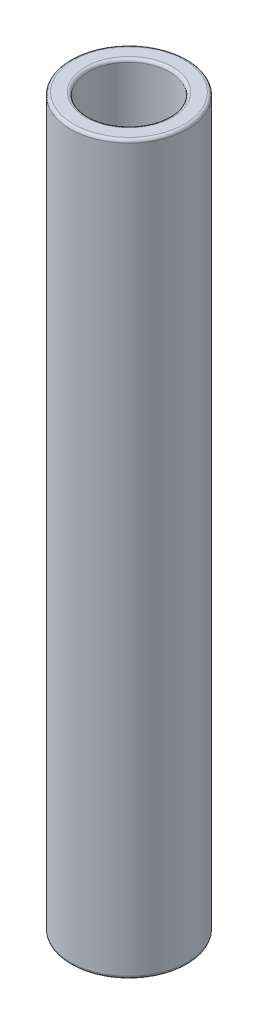
ISO-10303-21;
HEADER;
FILE_DESCRIPTION(('STEP AP214'),'2;1');
FILE_NAME('part.step','',(''),(''),'','','');
FILE_SCHEMA(('AUTOMOTIVE_DESIGN { 1 0 10303 214 1 1 1 1 }'));
ENDSEC;
DATA;
#1=APPLICATION_CONTEXT('core data for automotive mechanical design processes');
#2=APPLICATION_PROTOCOL_DEFINITION('international standard','automotive_design',2000,#1);
#3=PRODUCT_CONTEXT('',#1,'mechanical');
#4=PRODUCT('Part','Part','',(#3));
#5=PRODUCT_RELATED_PRODUCT_CATEGORY('part','',(#4));
#6=PRODUCT_DEFINITION_FORMATION('','',#4);
#7=PRODUCT_DEFINITION_CONTEXT('part definition',#1,'design');
#8=PRODUCT_DEFINITION('design','',#6,#7);
#9=PRODUCT_DEFINITION_SHAPE('','',#8);
#10=(LENGTH_UNIT() NAMED_UNIT(*) SI_UNIT(.MILLI.,.METRE.));
#11=(NAMED_UNIT(*) PLANE_ANGLE_UNIT() SI_UNIT($,.RADIAN.));
#12=(NAMED_UNIT(*) SI_UNIT($,.STERADIAN.) SOLID_ANGLE_UNIT());
#13=UNCERTAINTY_MEASURE_WITH_UNIT(LENGTH_MEASURE(1.E-05),#10,'distance_accuracy_value','');
#14=(GEOMETRIC_REPRESENTATION_CONTEXT(3) GLOBAL_UNCERTAINTY_ASSIGNED_CONTEXT((#13)) GLOBAL_UNIT_ASSIGNED_CONTEXT((#10,
#11,#12)) REPRESENTATION_CONTEXT('',''));
#15=CARTESIAN_POINT('',(0.,0.,0.));
#16=DIRECTION('',(0.,0.,1.));
#17=DIRECTION('',(1.,0.,0.));
#18=AXIS2_PLACEMENT_3D('',#15,#16,#17);
#19=CARTESIAN_POINT('',(0.,0.,0.));
#20=DIRECTION('',(0.,1.,0.));
#21=DIRECTION('',(0.,0.,1.));
#22=AXIS2_PLACEMENT_3D('',#19,#20,#21);
#23=PLANE('',#22);
#24=CARTESIAN_POINT('',(0.,0.,0.));
#25=DIRECTION('',(0.,1.,0.));
#26=DIRECTION('',(0.,0.,1.));
#27=AXIS2_PLACEMENT_3D('',#24,#25,#26);
#28=CIRCLE('',#27,2.94999999999999);
#29=CARTESIAN_POINT('',(0.,0.,2.94999999999999));
#30=VERTEX_POINT('',#29);
#31=EDGE_CURVE('E63',#30,#30,#28,.T.);
#32=ORIENTED_EDGE('',*,*,#31,.T.);
#33=EDGE_LOOP('',(#32));
#34=FACE_BOUND('',#33,.T.);
#35=CARTESIAN_POINT('',(0.,0.,0.));
#36=DIRECTION('',(0.,1.,0.));
#37=DIRECTION('',(0.,0.,1.));
#38=AXIS2_PLACEMENT_3D('',#35,#36,#37);
#39=CIRCLE('',#38,3.75);
#40=CARTESIAN_POINT('',(0.,0.,3.75));
#41=VERTEX_POINT('',#40);
#42=EDGE_CURVE('E66',#41,#41,#39,.F.);
#43=ORIENTED_EDGE('',*,*,#42,.T.);
#44=EDGE_LOOP('',(#43));
#45=FACE_BOUND('',#44,.T.);
#46=ADVANCED_FACE('F43',(#34,#45),#23,.F.);
#47=CARTESIAN_POINT('',(0.,49.15,0.));
#48=DIRECTION('',(0.,-1.,0.));
#49=DIRECTION('',(0.,0.,-1.));
#50=AXIS2_PLACEMENT_3D('',#47,#48,#49);
#51=CYLINDRICAL_SURFACE('',#50,3.95);
#52=CARTESIAN_POINT('',(0.,0.199999999999999,0.));
#53=DIRECTION('',(0.,1.,0.));
#54=DIRECTION('',(0.,0.,1.));
#55=AXIS2_PLACEMENT_3D('',#52,#53,#54);
#56=CIRCLE('',#55,3.95);
#57=CARTESIAN_POINT('',(0.,0.199999999999999,3.95));
#58=VERTEX_POINT('',#57);
#59=EDGE_CURVE('E54',#58,#58,#56,.T.);
#60=ORIENTED_EDGE('',*,*,#59,.T.);
#61=EDGE_LOOP('',(#60));
#62=FACE_BOUND('',#61,.T.);
#63=CARTESIAN_POINT('',(0.,48.95,0.));
#64=DIRECTION('',(0.,1.,0.));
#65=DIRECTION('',(0.,0.,1.));
#66=AXIS2_PLACEMENT_3D('',#63,#64,#65);
#67=CIRCLE('',#66,3.95);
#68=CARTESIAN_POINT('',(0.,48.95,3.95));
#69=VERTEX_POINT('',#68);
#70=EDGE_CURVE('E58',#69,#69,#67,.F.);
#71=ORIENTED_EDGE('',*,*,#70,.T.);
#72=EDGE_LOOP('',(#71));
#73=FACE_BOUND('',#72,.T.);
#74=ADVANCED_FACE('F87',(#62,#73),#51,.T.);
#75=CARTESIAN_POINT('',(0.,49.15,0.));
#76=DIRECTION('',(0.,1.,0.));
#77=DIRECTION('',(0.,0.,1.));
#78=AXIS2_PLACEMENT_3D('',#75,#76,#77);
#79=PLANE('',#78);
#80=CARTESIAN_POINT('',(0.,49.15,0.));
#81=DIRECTION('',(0.,1.,0.));
#82=DIRECTION('',(0.,0.,1.));
#83=AXIS2_PLACEMENT_3D('',#80,#81,#82);
#84=CIRCLE('',#83,3.75);
#85=CARTESIAN_POINT('',(0.,49.15,3.75));
#86=VERTEX_POINT('',#85);
#87=EDGE_CURVE('E10',#86,#86,#84,.T.);
#88=ORIENTED_EDGE('',*,*,#87,.T.);
#89=EDGE_LOOP('',(#88));
#90=FACE_BOUND('',#89,.T.);
#91=CARTESIAN_POINT('',(0.,49.15,0.));
#92=DIRECTION('',(0.,1.,0.));
#93=DIRECTION('',(0.,0.,1.));
#94=AXIS2_PLACEMENT_3D('',#91,#92,#93);
#95=CIRCLE('',#94,2.94999999999999);
#96=CARTESIAN_POINT('',(0.,49.15,2.94999999999999));
#97=VERTEX_POINT('',#96);
#98=EDGE_CURVE('E50',#97,#97,#95,.F.);
#99=ORIENTED_EDGE('',*,*,#98,.T.);
#100=EDGE_LOOP('',(#99));
#101=FACE_BOUND('',#100,.T.);
#102=ADVANCED_FACE('F93',(#90,#101),#79,.T.);
#103=CARTESIAN_POINT('',(0.,49.15,0.));
#104=DIRECTION('',(0.,1.,0.));
#105=DIRECTION('',(0.,0.,1.));
#106=AXIS2_PLACEMENT_3D('',#103,#104,#105);
#107=CYLINDRICAL_SURFACE('',#106,2.74999999999999);
#108=CARTESIAN_POINT('',(0.,0.199999999999999,0.));
#109=DIRECTION('',(0.,1.,0.));
#110=DIRECTION('',(0.,0.,1.));
#111=AXIS2_PLACEMENT_3D('',#108,#109,#110);
#112=CIRCLE('',#111,2.74999999999999);
#113=CARTESIAN_POINT('',(0.,0.199999999999999,2.74999999999999));
#114=VERTEX_POINT('',#113);
#115=EDGE_CURVE('E69',#114,#114,#112,.F.);
#116=ORIENTED_EDGE('',*,*,#115,.T.);
#117=EDGE_LOOP('',(#116));
#118=FACE_BOUND('',#117,.T.);
#119=CARTESIAN_POINT('',(0.,48.95,0.));
#120=DIRECTION('',(0.,1.,0.));
#121=DIRECTION('',(0.,0.,1.));
#122=AXIS2_PLACEMENT_3D('',#119,#120,#121);
#123=CIRCLE('',#122,2.74999999999999);
#124=CARTESIAN_POINT('',(0.,48.95,2.74999999999999));
#125=VERTEX_POINT('',#124);
#126=EDGE_CURVE('E72',#125,#125,#123,.T.);
#127=ORIENTED_EDGE('',*,*,#126,.T.);
#128=EDGE_LOOP('',(#127));
#129=FACE_BOUND('',#128,.T.);
#130=ADVANCED_FACE('F76',(#118,#129),#107,.F.);
#131=CARTESIAN_POINT('',(0.,0.199999999999999,0.));
#132=DIRECTION('',(0.,1.,0.));
#133=DIRECTION('',(0.,0.,1.));
#134=AXIS2_PLACEMENT_3D('',#131,#132,#133);
#135=TOROIDAL_SURFACE('',#134,2.94999999999999,0.2);
#136=ORIENTED_EDGE('',*,*,#31,.F.);
#137=EDGE_LOOP('',(#136));
#138=FACE_BOUND('',#137,.T.);
#139=ORIENTED_EDGE('',*,*,#115,.F.);
#140=EDGE_LOOP('',(#139));
#141=FACE_BOUND('',#140,.T.);
#142=ADVANCED_FACE('F100',(#138,#141),#135,.T.);
#143=CARTESIAN_POINT('',(0.,0.199999999999999,0.));
#144=DIRECTION('',(0.,1.,0.));
#145=DIRECTION('',(0.,0.,1.));
#146=AXIS2_PLACEMENT_3D('',#143,#144,#145);
#147=TOROIDAL_SURFACE('',#146,3.75,0.2);
#148=ORIENTED_EDGE('',*,*,#42,.F.);
#149=EDGE_LOOP('',(#148));
#150=FACE_BOUND('',#149,.T.);
#151=ORIENTED_EDGE('',*,*,#59,.F.);
#152=EDGE_LOOP('',(#151));
#153=FACE_BOUND('',#152,.T.);
#154=ADVANCED_FACE('F84',(#150,#153),#147,.T.);
#155=CARTESIAN_POINT('',(0.,48.95,0.));
#156=DIRECTION('',(0.,1.,0.));
#157=DIRECTION('',(0.,0.,1.));
#158=AXIS2_PLACEMENT_3D('',#155,#156,#157);
#159=TOROIDAL_SURFACE('',#158,3.75,0.2);
#160=ORIENTED_EDGE('',*,*,#70,.F.);
#161=EDGE_LOOP('',(#160));
#162=FACE_BOUND('',#161,.T.);
#163=ORIENTED_EDGE('',*,*,#87,.F.);
#164=EDGE_LOOP('',(#163));
#165=FACE_BOUND('',#164,.T.);
#166=ADVANCED_FACE('F79',(#162,#165),#159,.T.);
#167=CARTESIAN_POINT('',(0.,48.95,0.));
#168=DIRECTION('',(0.,1.,0.));
#169=DIRECTION('',(0.,0.,1.));
#170=AXIS2_PLACEMENT_3D('',#167,#168,#169);
#171=TOROIDAL_SURFACE('',#170,2.94999999999999,0.2);
#172=ORIENTED_EDGE('',*,*,#98,.F.);
#173=EDGE_LOOP('',(#172));
#174=FACE_BOUND('',#173,.T.);
#175=ORIENTED_EDGE('',*,*,#126,.F.);
#176=EDGE_LOOP('',(#175));
#177=FACE_BOUND('',#176,.T.);
#178=ADVANCED_FACE('F45',(#174,#177),#171,.T.);
#179=CLOSED_SHELL('',(#46,#74,#102,#130,#142,#154,#166,#178));
#180=MANIFOLD_SOLID_BREP('B2',#179);
#181=ADVANCED_BREP_SHAPE_REPRESENTATION('',(#18,#180),#14);
#182=SHAPE_DEFINITION_REPRESENTATION(#9,#181);
ENDSEC;
END-ISO-10303-21;
